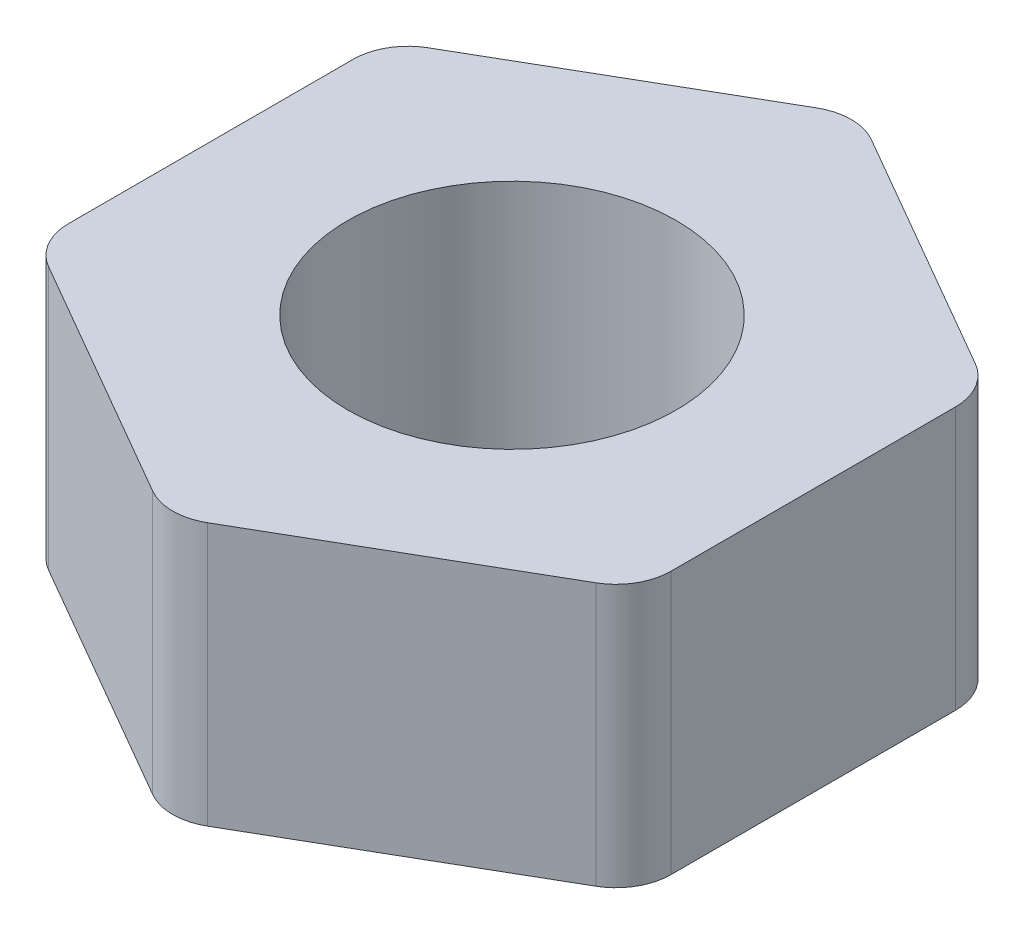
ISO-10303-21;
HEADER;
FILE_DESCRIPTION(('STEP AP214'),'2;1');
FILE_NAME('part.step','',(''),(''),'','','');
FILE_SCHEMA(('AUTOMOTIVE_DESIGN { 1 0 10303 214 1 1 1 1 }'));
ENDSEC;
DATA;
#1=APPLICATION_CONTEXT('core data for automotive mechanical design processes');
#2=APPLICATION_PROTOCOL_DEFINITION('international standard','automotive_design',2000,#1);
#3=PRODUCT_CONTEXT('',#1,'mechanical');
#4=PRODUCT('Part','Part','',(#3));
#5=PRODUCT_RELATED_PRODUCT_CATEGORY('part','',(#4));
#6=PRODUCT_DEFINITION_FORMATION('','',#4);
#7=PRODUCT_DEFINITION_CONTEXT('part definition',#1,'design');
#8=PRODUCT_DEFINITION('design','',#6,#7);
#9=PRODUCT_DEFINITION_SHAPE('','',#8);
#10=(LENGTH_UNIT() NAMED_UNIT(*) SI_UNIT(.MILLI.,.METRE.));
#11=(NAMED_UNIT(*) PLANE_ANGLE_UNIT() SI_UNIT($,.RADIAN.));
#12=(NAMED_UNIT(*) SI_UNIT($,.STERADIAN.) SOLID_ANGLE_UNIT());
#13=UNCERTAINTY_MEASURE_WITH_UNIT(LENGTH_MEASURE(1.E-05),#10,'distance_accuracy_value','');
#14=(GEOMETRIC_REPRESENTATION_CONTEXT(3) GLOBAL_UNCERTAINTY_ASSIGNED_CONTEXT((#13)) GLOBAL_UNIT_ASSIGNED_CONTEXT((#10,
#11,#12)) REPRESENTATION_CONTEXT('',''));
#15=CARTESIAN_POINT('',(0.,0.,0.));
#16=DIRECTION('',(0.,0.,1.));
#17=DIRECTION('',(1.,0.,0.));
#18=AXIS2_PLACEMENT_3D('',#15,#16,#17);
#19=CARTESIAN_POINT('',(0.,2.4,0.));
#20=DIRECTION('',(0.,1.,0.));
#21=DIRECTION('',(0.,0.,1.));
#22=AXIS2_PLACEMENT_3D('',#19,#20,#21);
#23=PLANE('',#22);
#24=DIRECTION('',(-0.866025403784439,0.,0.5));
#25=VECTOR('',#24,1.);
#26=CARTESIAN_POINT('',(0.,2.4,-3.17542648054294));
#27=LINE('',#26,#25);
#28=CARTESIAN_POINT('',(-0.249999999999999,2.4,-3.03108891324554));
#29=VERTEX_POINT('',#28);
#30=CARTESIAN_POINT('',(-2.5,2.4,-1.73205080756888));
#31=VERTEX_POINT('',#30);
#32=EDGE_CURVE('E289',#29,#31,#27,.T.);
#33=ORIENTED_EDGE('',*,*,#32,.T.);
#34=CARTESIAN_POINT('',(-2.25,2.4,-1.29903810567666));
#35=DIRECTION('',(0.,1.,0.));
#36=DIRECTION('',(0.,0.,1.));
#37=AXIS2_PLACEMENT_3D('',#34,#35,#36);
#38=CIRCLE('',#37,0.5);
#39=CARTESIAN_POINT('',(-2.75,2.4,-1.29903810567666));
#40=VERTEX_POINT('',#39);
#41=EDGE_CURVE('E220',#31,#40,#38,.T.);
#42=ORIENTED_EDGE('',*,*,#41,.T.);
#43=DIRECTION('',(0.,0.,1.));
#44=VECTOR('',#43,1.);
#45=CARTESIAN_POINT('',(-2.75,2.4,-1.58771324027147));
#46=LINE('',#45,#44);
#47=CARTESIAN_POINT('',(-2.75,2.4,1.29903810567666));
#48=VERTEX_POINT('',#47);
#49=EDGE_CURVE('E157',#40,#48,#46,.T.);
#50=ORIENTED_EDGE('',*,*,#49,.T.);
#51=CARTESIAN_POINT('',(-2.25,2.4,1.29903810567666));
#52=DIRECTION('',(0.,1.,0.));
#53=DIRECTION('',(0.,0.,1.));
#54=AXIS2_PLACEMENT_3D('',#51,#52,#53);
#55=CIRCLE('',#54,0.5);
#56=CARTESIAN_POINT('',(-2.5,2.4,1.73205080756888));
#57=VERTEX_POINT('',#56);
#58=EDGE_CURVE('E206',#48,#57,#55,.T.);
#59=ORIENTED_EDGE('',*,*,#58,.T.);
#60=DIRECTION('',(0.866025403784438,0.,0.5));
#61=VECTOR('',#60,1.);
#62=CARTESIAN_POINT('',(-2.75,2.4,1.58771324027147));
#63=LINE('',#62,#61);
#64=CARTESIAN_POINT('',(-0.250000000000001,2.4,3.03108891324554));
#65=VERTEX_POINT('',#64);
#66=EDGE_CURVE('E250',#57,#65,#63,.T.);
#67=ORIENTED_EDGE('',*,*,#66,.T.);
#68=CARTESIAN_POINT('',(0.,2.4,2.59807621135332));
#69=DIRECTION('',(0.,1.,0.));
#70=DIRECTION('',(0.,0.,1.));
#71=AXIS2_PLACEMENT_3D('',#68,#69,#70);
#72=CIRCLE('',#71,0.5);
#73=CARTESIAN_POINT('',(0.249999999999999,2.4,3.03108891324554));
#74=VERTEX_POINT('',#73);
#75=EDGE_CURVE('E209',#65,#74,#72,.T.);
#76=ORIENTED_EDGE('',*,*,#75,.T.);
#77=DIRECTION('',(0.866025403784439,0.,-0.5));
#78=VECTOR('',#77,1.);
#79=CARTESIAN_POINT('',(0.,2.4,3.17542648054294));
#80=LINE('',#79,#78);
#81=CARTESIAN_POINT('',(2.5,2.4,1.73205080756888));
#82=VERTEX_POINT('',#81);
#83=EDGE_CURVE('E262',#74,#82,#80,.T.);
#84=ORIENTED_EDGE('',*,*,#83,.T.);
#85=CARTESIAN_POINT('',(2.25,2.4,1.29903810567666));
#86=DIRECTION('',(0.,1.,0.));
#87=DIRECTION('',(0.,0.,1.));
#88=AXIS2_PLACEMENT_3D('',#85,#86,#87);
#89=CIRCLE('',#88,0.5);
#90=CARTESIAN_POINT('',(2.75,2.4,1.29903810567666));
#91=VERTEX_POINT('',#90);
#92=EDGE_CURVE('E68',#82,#91,#89,.T.);
#93=ORIENTED_EDGE('',*,*,#92,.T.);
#94=DIRECTION('',(0.,0.,-1.));
#95=VECTOR('',#94,1.);
#96=CARTESIAN_POINT('',(2.75,2.4,1.58771324027147));
#97=LINE('',#96,#95);
#98=CARTESIAN_POINT('',(2.75,2.4,-1.29903810567666));
#99=VERTEX_POINT('',#98);
#100=EDGE_CURVE('E186',#91,#99,#97,.T.);
#101=ORIENTED_EDGE('',*,*,#100,.T.);
#102=CARTESIAN_POINT('',(2.25,2.4,-1.29903810567666));
#103=DIRECTION('',(0.,1.,0.));
#104=DIRECTION('',(0.,0.,1.));
#105=AXIS2_PLACEMENT_3D('',#102,#103,#104);
#106=CIRCLE('',#105,0.5);
#107=CARTESIAN_POINT('',(2.5,2.4,-1.73205080756888));
#108=VERTEX_POINT('',#107);
#109=EDGE_CURVE('E214',#99,#108,#106,.T.);
#110=ORIENTED_EDGE('',*,*,#109,.T.);
#111=DIRECTION('',(-0.866025403784439,0.,-0.5));
#112=VECTOR('',#111,1.);
#113=CARTESIAN_POINT('',(2.75,2.4,-1.58771324027147));
#114=LINE('',#113,#112);
#115=CARTESIAN_POINT('',(0.25,2.4,-3.03108891324554));
#116=VERTEX_POINT('',#115);
#117=EDGE_CURVE('E184',#108,#116,#114,.T.);
#118=ORIENTED_EDGE('',*,*,#117,.T.);
#119=CARTESIAN_POINT('',(0.,2.4,-2.59807621135332));
#120=DIRECTION('',(0.,1.,0.));
#121=DIRECTION('',(0.,0.,1.));
#122=AXIS2_PLACEMENT_3D('',#119,#120,#121);
#123=CIRCLE('',#122,0.5);
#124=EDGE_CURVE('E217',#116,#29,#123,.T.);
#125=ORIENTED_EDGE('',*,*,#124,.T.);
#126=EDGE_LOOP('',(#33,#42,#50,#59,#67,#76,#84,#93,#101,#110,#118,#125));
#127=FACE_BOUND('',#126,.T.);
#128=CARTESIAN_POINT('',(0.,2.4,0.));
#129=DIRECTION('',(0.,1.,0.));
#130=DIRECTION('',(0.,0.,1.));
#131=AXIS2_PLACEMENT_3D('',#128,#129,#130);
#132=CIRCLE('',#131,1.5);
#133=CARTESIAN_POINT('',(0.,2.4,1.5));
#134=VERTEX_POINT('',#133);
#135=EDGE_CURVE('E272',#134,#134,#132,.T.);
#136=ORIENTED_EDGE('',*,*,#135,.F.);
#137=EDGE_LOOP('',(#136));
#138=FACE_BOUND('',#137,.T.);
#139=ADVANCED_FACE('F45',(#127,#138),#23,.T.);
#140=CARTESIAN_POINT('',(0.,0.,0.));
#141=DIRECTION('',(0.,1.,0.));
#142=DIRECTION('',(0.,0.,1.));
#143=AXIS2_PLACEMENT_3D('',#140,#141,#142);
#144=PLANE('',#143);
#145=DIRECTION('',(0.,0.,1.));
#146=VECTOR('',#145,1.);
#147=CARTESIAN_POINT('',(-2.75,0.,-1.58771324027147));
#148=LINE('',#147,#146);
#149=CARTESIAN_POINT('',(-2.75,0.,-1.29903810567666));
#150=VERTEX_POINT('',#149);
#151=CARTESIAN_POINT('',(-2.75,0.,1.29903810567666));
#152=VERTEX_POINT('',#151);
#153=EDGE_CURVE('E154',#150,#152,#148,.T.);
#154=ORIENTED_EDGE('',*,*,#153,.F.);
#155=CARTESIAN_POINT('',(-2.25,0.,-1.29903810567666));
#156=DIRECTION('',(0.,1.,0.));
#157=DIRECTION('',(0.,0.,1.));
#158=AXIS2_PLACEMENT_3D('',#155,#156,#157);
#159=CIRCLE('',#158,0.5);
#160=CARTESIAN_POINT('',(-2.5,0.,-1.73205080756888));
#161=VERTEX_POINT('',#160);
#162=EDGE_CURVE('E136',#150,#161,#159,.F.);
#163=ORIENTED_EDGE('',*,*,#162,.T.);
#164=DIRECTION('',(-0.866025403784439,0.,0.5));
#165=VECTOR('',#164,1.);
#166=CARTESIAN_POINT('',(0.,0.,-3.17542648054294));
#167=LINE('',#166,#165);
#168=CARTESIAN_POINT('',(-0.249999999999999,0.,-3.03108891324554));
#169=VERTEX_POINT('',#168);
#170=EDGE_CURVE('E167',#169,#161,#167,.T.);
#171=ORIENTED_EDGE('',*,*,#170,.F.);
#172=CARTESIAN_POINT('',(0.,0.,-2.59807621135332));
#173=DIRECTION('',(0.,1.,0.));
#174=DIRECTION('',(0.,0.,1.));
#175=AXIS2_PLACEMENT_3D('',#172,#173,#174);
#176=CIRCLE('',#175,0.5);
#177=CARTESIAN_POINT('',(0.25,0.,-3.03108891324554));
#178=VERTEX_POINT('',#177);
#179=EDGE_CURVE('E148',#169,#178,#176,.F.);
#180=ORIENTED_EDGE('',*,*,#179,.T.);
#181=DIRECTION('',(-0.866025403784439,0.,-0.5));
#182=VECTOR('',#181,1.);
#183=CARTESIAN_POINT('',(2.75,0.,-1.58771324027147));
#184=LINE('',#183,#182);
#185=CARTESIAN_POINT('',(2.5,0.,-1.73205080756888));
#186=VERTEX_POINT('',#185);
#187=EDGE_CURVE('E174',#186,#178,#184,.T.);
#188=ORIENTED_EDGE('',*,*,#187,.F.);
#189=CARTESIAN_POINT('',(2.25,0.,-1.29903810567666));
#190=DIRECTION('',(0.,1.,0.));
#191=DIRECTION('',(0.,0.,1.));
#192=AXIS2_PLACEMENT_3D('',#189,#190,#191);
#193=CIRCLE('',#192,0.5);
#194=CARTESIAN_POINT('',(2.75,0.,-1.29903810567666));
#195=VERTEX_POINT('',#194);
#196=EDGE_CURVE('E196',#186,#195,#193,.F.);
#197=ORIENTED_EDGE('',*,*,#196,.T.);
#198=DIRECTION('',(0.,0.,-1.));
#199=VECTOR('',#198,1.);
#200=CARTESIAN_POINT('',(2.75,0.,1.58771324027147));
#201=LINE('',#200,#199);
#202=CARTESIAN_POINT('',(2.75,0.,1.29903810567666));
#203=VERTEX_POINT('',#202);
#204=EDGE_CURVE('E181',#203,#195,#201,.T.);
#205=ORIENTED_EDGE('',*,*,#204,.F.);
#206=CARTESIAN_POINT('',(2.25,0.,1.29903810567666));
#207=DIRECTION('',(0.,1.,0.));
#208=DIRECTION('',(0.,0.,1.));
#209=AXIS2_PLACEMENT_3D('',#206,#207,#208);
#210=CIRCLE('',#209,0.5);
#211=CARTESIAN_POINT('',(2.5,0.,1.73205080756888));
#212=VERTEX_POINT('',#211);
#213=EDGE_CURVE('E193',#203,#212,#210,.F.);
#214=ORIENTED_EDGE('',*,*,#213,.T.);
#215=DIRECTION('',(0.866025403784439,0.,-0.5));
#216=VECTOR('',#215,1.);
#217=CARTESIAN_POINT('',(0.,0.,3.17542648054294));
#218=LINE('',#217,#216);
#219=CARTESIAN_POINT('',(0.249999999999999,0.,3.03108891324554));
#220=VERTEX_POINT('',#219);
#221=EDGE_CURVE('E172',#220,#212,#218,.T.);
#222=ORIENTED_EDGE('',*,*,#221,.F.);
#223=CARTESIAN_POINT('',(0.,0.,2.59807621135332));
#224=DIRECTION('',(0.,1.,0.));
#225=DIRECTION('',(0.,0.,1.));
#226=AXIS2_PLACEMENT_3D('',#223,#224,#225);
#227=CIRCLE('',#226,0.5);
#228=CARTESIAN_POINT('',(-0.250000000000001,0.,3.03108891324554));
#229=VERTEX_POINT('',#228);
#230=EDGE_CURVE('E190',#220,#229,#227,.F.);
#231=ORIENTED_EDGE('',*,*,#230,.T.);
#232=DIRECTION('',(0.866025403784438,0.,0.5));
#233=VECTOR('',#232,1.);
#234=CARTESIAN_POINT('',(-2.75,0.,1.58771324027147));
#235=LINE('',#234,#233);
#236=CARTESIAN_POINT('',(-2.5,0.,1.73205080756888));
#237=VERTEX_POINT('',#236);
#238=EDGE_CURVE('E166',#237,#229,#235,.T.);
#239=ORIENTED_EDGE('',*,*,#238,.F.);
#240=CARTESIAN_POINT('',(-2.25,0.,1.29903810567666));
#241=DIRECTION('',(0.,1.,0.));
#242=DIRECTION('',(0.,0.,1.));
#243=AXIS2_PLACEMENT_3D('',#240,#241,#242);
#244=CIRCLE('',#243,0.5);
#245=EDGE_CURVE('E159',#237,#152,#244,.F.);
#246=ORIENTED_EDGE('',*,*,#245,.T.);
#247=EDGE_LOOP('',(#154,#163,#171,#180,#188,#197,#205,#214,#222,#231,#239,#246));
#248=FACE_BOUND('',#247,.T.);
#249=CARTESIAN_POINT('',(0.,0.,0.));
#250=DIRECTION('',(0.,1.,0.));
#251=DIRECTION('',(0.,0.,1.));
#252=AXIS2_PLACEMENT_3D('',#249,#250,#251);
#253=CIRCLE('',#252,1.5);
#254=CARTESIAN_POINT('',(0.,0.,1.5));
#255=VERTEX_POINT('',#254);
#256=EDGE_CURVE('E278',#255,#255,#253,.T.);
#257=ORIENTED_EDGE('',*,*,#256,.T.);
#258=EDGE_LOOP('',(#257));
#259=FACE_BOUND('',#258,.T.);
#260=ADVANCED_FACE('F162',(#248,#259),#144,.F.);
#261=CARTESIAN_POINT('',(2.75,2.4,-1.58771324027147));
#262=DIRECTION('',(-0.5,0.,0.866025403784439));
#263=DIRECTION('',(0.866025403784439,0.,0.5));
#264=AXIS2_PLACEMENT_3D('',#261,#262,#263);
#265=PLANE('',#264);
#266=ORIENTED_EDGE('',*,*,#187,.T.);
#267=DIRECTION('',(0.,-1.,0.));
#268=VECTOR('',#267,1.);
#269=CARTESIAN_POINT('',(0.25,2.4,-3.03108891324554));
#270=LINE('',#269,#268);
#271=EDGE_CURVE('E227',#178,#116,#270,.F.);
#272=ORIENTED_EDGE('',*,*,#271,.T.);
#273=ORIENTED_EDGE('',*,*,#117,.F.);
#274=DIRECTION('',(0.,-1.,0.));
#275=VECTOR('',#274,1.);
#276=CARTESIAN_POINT('',(2.5,2.4,-1.73205080756888));
#277=LINE('',#276,#275);
#278=EDGE_CURVE('E223',#108,#186,#277,.T.);
#279=ORIENTED_EDGE('',*,*,#278,.T.);
#280=EDGE_LOOP('',(#266,#272,#273,#279));
#281=FACE_BOUND('',#280,.T.);
#282=ADVANCED_FACE('F305',(#281),#265,.F.);
#283=CARTESIAN_POINT('',(0.,2.4,-3.17542648054294));
#284=DIRECTION('',(0.5,0.,0.866025403784439));
#285=DIRECTION('',(0.866025403784439,0.,-0.5));
#286=AXIS2_PLACEMENT_3D('',#283,#284,#285);
#287=PLANE('',#286);
#288=ORIENTED_EDGE('',*,*,#170,.T.);
#289=DIRECTION('',(0.,-1.,0.));
#290=VECTOR('',#289,1.);
#291=CARTESIAN_POINT('',(-2.5,2.4,-1.73205080756888));
#292=LINE('',#291,#290);
#293=EDGE_CURVE('E141',#161,#31,#292,.F.);
#294=ORIENTED_EDGE('',*,*,#293,.T.);
#295=ORIENTED_EDGE('',*,*,#32,.F.);
#296=DIRECTION('',(0.,-1.,0.));
#297=VECTOR('',#296,1.);
#298=CARTESIAN_POINT('',(-0.249999999999999,2.4,-3.03108891324554));
#299=LINE('',#298,#297);
#300=EDGE_CURVE('E147',#29,#169,#299,.T.);
#301=ORIENTED_EDGE('',*,*,#300,.T.);
#302=EDGE_LOOP('',(#288,#294,#295,#301));
#303=FACE_BOUND('',#302,.T.);
#304=ADVANCED_FACE('F319',(#303),#287,.F.);
#305=CARTESIAN_POINT('',(-2.75,2.4,-1.58771324027147));
#306=DIRECTION('',(1.,0.,0.));
#307=DIRECTION('',(0.,0.,-1.));
#308=AXIS2_PLACEMENT_3D('',#305,#306,#307);
#309=PLANE('',#308);
#310=ORIENTED_EDGE('',*,*,#49,.F.);
#311=DIRECTION('',(0.,-1.,0.));
#312=VECTOR('',#311,1.);
#313=CARTESIAN_POINT('',(-2.75,2.4,-1.29903810567666));
#314=LINE('',#313,#312);
#315=EDGE_CURVE('E140',#40,#150,#314,.T.);
#316=ORIENTED_EDGE('',*,*,#315,.T.);
#317=ORIENTED_EDGE('',*,*,#153,.T.);
#318=DIRECTION('',(0.,-1.,0.));
#319=VECTOR('',#318,1.);
#320=CARTESIAN_POINT('',(-2.75,2.4,1.29903810567666));
#321=LINE('',#320,#319);
#322=EDGE_CURVE('E160',#152,#48,#321,.F.);
#323=ORIENTED_EDGE('',*,*,#322,.T.);
#324=EDGE_LOOP('',(#310,#316,#317,#323));
#325=FACE_BOUND('',#324,.T.);
#326=ADVANCED_FACE('F153',(#325),#309,.F.);
#327=CARTESIAN_POINT('',(-2.75,2.4,1.58771324027147));
#328=DIRECTION('',(0.5,0.,-0.866025403784439));
#329=DIRECTION('',(-0.866025403784439,0.,-0.5));
#330=AXIS2_PLACEMENT_3D('',#327,#328,#329);
#331=PLANE('',#330);
#332=ORIENTED_EDGE('',*,*,#238,.T.);
#333=DIRECTION('',(0.,-1.,0.));
#334=VECTOR('',#333,1.);
#335=CARTESIAN_POINT('',(-0.250000000000001,2.4,3.03108891324554));
#336=LINE('',#335,#334);
#337=EDGE_CURVE('E11',#229,#65,#336,.F.);
#338=ORIENTED_EDGE('',*,*,#337,.T.);
#339=ORIENTED_EDGE('',*,*,#66,.F.);
#340=DIRECTION('',(0.,-1.,0.));
#341=VECTOR('',#340,1.);
#342=CARTESIAN_POINT('',(-2.5,2.4,1.73205080756888));
#343=LINE('',#342,#341);
#344=EDGE_CURVE('E54',#57,#237,#343,.T.);
#345=ORIENTED_EDGE('',*,*,#344,.T.);
#346=EDGE_LOOP('',(#332,#338,#339,#345));
#347=FACE_BOUND('',#346,.T.);
#348=ADVANCED_FACE('F247',(#347),#331,.F.);
#349=CARTESIAN_POINT('',(0.,2.4,3.17542648054294));
#350=DIRECTION('',(-0.5,0.,-0.866025403784439));
#351=DIRECTION('',(-0.866025403784439,0.,0.5));
#352=AXIS2_PLACEMENT_3D('',#349,#350,#351);
#353=PLANE('',#352);
#354=ORIENTED_EDGE('',*,*,#221,.T.);
#355=DIRECTION('',(0.,-1.,0.));
#356=VECTOR('',#355,1.);
#357=CARTESIAN_POINT('',(2.5,2.4,1.73205080756888));
#358=LINE('',#357,#356);
#359=EDGE_CURVE('E240',#212,#82,#358,.F.);
#360=ORIENTED_EDGE('',*,*,#359,.T.);
#361=ORIENTED_EDGE('',*,*,#83,.F.);
#362=DIRECTION('',(0.,-1.,0.));
#363=VECTOR('',#362,1.);
#364=CARTESIAN_POINT('',(0.249999999999999,2.4,3.03108891324554));
#365=LINE('',#364,#363);
#366=EDGE_CURVE('E236',#74,#220,#365,.T.);
#367=ORIENTED_EDGE('',*,*,#366,.T.);
#368=EDGE_LOOP('',(#354,#360,#361,#367));
#369=FACE_BOUND('',#368,.T.);
#370=ADVANCED_FACE('F260',(#369),#353,.F.);
#371=CARTESIAN_POINT('',(2.75,2.4,1.58771324027147));
#372=DIRECTION('',(-1.,0.,0.));
#373=DIRECTION('',(0.,0.,1.));
#374=AXIS2_PLACEMENT_3D('',#371,#372,#373);
#375=PLANE('',#374);
#376=ORIENTED_EDGE('',*,*,#204,.T.);
#377=DIRECTION('',(0.,-1.,0.));
#378=VECTOR('',#377,1.);
#379=CARTESIAN_POINT('',(2.75,2.4,-1.29903810567666));
#380=LINE('',#379,#378);
#381=EDGE_CURVE('E61',#195,#99,#380,.F.);
#382=ORIENTED_EDGE('',*,*,#381,.T.);
#383=ORIENTED_EDGE('',*,*,#100,.F.);
#384=DIRECTION('',(0.,-1.,0.));
#385=VECTOR('',#384,1.);
#386=CARTESIAN_POINT('',(2.75,2.4,1.29903810567666));
#387=LINE('',#386,#385);
#388=EDGE_CURVE('E230',#91,#203,#387,.T.);
#389=ORIENTED_EDGE('',*,*,#388,.T.);
#390=EDGE_LOOP('',(#376,#382,#383,#389));
#391=FACE_BOUND('',#390,.T.);
#392=ADVANCED_FACE('F310',(#391),#375,.F.);
#393=CARTESIAN_POINT('',(0.,2.4,0.));
#394=DIRECTION('',(0.,-1.,0.));
#395=DIRECTION('',(0.,0.,-1.));
#396=AXIS2_PLACEMENT_3D('',#393,#394,#395);
#397=CYLINDRICAL_SURFACE('',#396,1.5);
#398=ORIENTED_EDGE('',*,*,#135,.T.);
#399=EDGE_LOOP('',(#398));
#400=FACE_BOUND('',#399,.T.);
#401=ORIENTED_EDGE('',*,*,#256,.F.);
#402=EDGE_LOOP('',(#401));
#403=FACE_BOUND('',#402,.T.);
#404=ADVANCED_FACE('F308',(#400,#403),#397,.F.);
#405=CARTESIAN_POINT('',(-2.25,2.4,-1.29903810567666));
#406=DIRECTION('',(0.,-1.,0.));
#407=DIRECTION('',(0.,0.,-1.));
#408=AXIS2_PLACEMENT_3D('',#405,#406,#407);
#409=CYLINDRICAL_SURFACE('',#408,0.5);
#410=ORIENTED_EDGE('',*,*,#41,.F.);
#411=ORIENTED_EDGE('',*,*,#293,.F.);
#412=ORIENTED_EDGE('',*,*,#162,.F.);
#413=ORIENTED_EDGE('',*,*,#315,.F.);
#414=EDGE_LOOP('',(#410,#411,#412,#413));
#415=FACE_BOUND('',#414,.T.);
#416=ADVANCED_FACE('F139',(#415),#409,.T.);
#417=CARTESIAN_POINT('',(0.,2.4,-2.59807621135332));
#418=DIRECTION('',(0.,-1.,0.));
#419=DIRECTION('',(0.,0.,-1.));
#420=AXIS2_PLACEMENT_3D('',#417,#418,#419);
#421=CYLINDRICAL_SURFACE('',#420,0.5);
#422=ORIENTED_EDGE('',*,*,#124,.F.);
#423=ORIENTED_EDGE('',*,*,#271,.F.);
#424=ORIENTED_EDGE('',*,*,#179,.F.);
#425=ORIENTED_EDGE('',*,*,#300,.F.);
#426=EDGE_LOOP('',(#422,#423,#424,#425));
#427=FACE_BOUND('',#426,.T.);
#428=ADVANCED_FACE('F327',(#427),#421,.T.);
#429=CARTESIAN_POINT('',(2.25,2.4,-1.29903810567666));
#430=DIRECTION('',(0.,-1.,0.));
#431=DIRECTION('',(0.,0.,-1.));
#432=AXIS2_PLACEMENT_3D('',#429,#430,#431);
#433=CYLINDRICAL_SURFACE('',#432,0.5);
#434=ORIENTED_EDGE('',*,*,#109,.F.);
#435=ORIENTED_EDGE('',*,*,#381,.F.);
#436=ORIENTED_EDGE('',*,*,#196,.F.);
#437=ORIENTED_EDGE('',*,*,#278,.F.);
#438=EDGE_LOOP('',(#434,#435,#436,#437));
#439=FACE_BOUND('',#438,.T.);
#440=ADVANCED_FACE('F330',(#439),#433,.T.);
#441=CARTESIAN_POINT('',(2.25,2.4,1.29903810567666));
#442=DIRECTION('',(0.,-1.,0.));
#443=DIRECTION('',(0.,0.,-1.));
#444=AXIS2_PLACEMENT_3D('',#441,#442,#443);
#445=CYLINDRICAL_SURFACE('',#444,0.5);
#446=ORIENTED_EDGE('',*,*,#92,.F.);
#447=ORIENTED_EDGE('',*,*,#359,.F.);
#448=ORIENTED_EDGE('',*,*,#213,.F.);
#449=ORIENTED_EDGE('',*,*,#388,.F.);
#450=EDGE_LOOP('',(#446,#447,#448,#449));
#451=FACE_BOUND('',#450,.T.);
#452=ADVANCED_FACE('F298',(#451),#445,.T.);
#453=CARTESIAN_POINT('',(0.,2.4,2.59807621135332));
#454=DIRECTION('',(0.,-1.,0.));
#455=DIRECTION('',(0.,0.,-1.));
#456=AXIS2_PLACEMENT_3D('',#453,#454,#455);
#457=CYLINDRICAL_SURFACE('',#456,0.5);
#458=ORIENTED_EDGE('',*,*,#75,.F.);
#459=ORIENTED_EDGE('',*,*,#337,.F.);
#460=ORIENTED_EDGE('',*,*,#230,.F.);
#461=ORIENTED_EDGE('',*,*,#366,.F.);
#462=EDGE_LOOP('',(#458,#459,#460,#461));
#463=FACE_BOUND('',#462,.T.);
#464=ADVANCED_FACE('F257',(#463),#457,.T.);
#465=CARTESIAN_POINT('',(-2.25,2.4,1.29903810567666));
#466=DIRECTION('',(0.,-1.,0.));
#467=DIRECTION('',(0.,0.,-1.));
#468=AXIS2_PLACEMENT_3D('',#465,#466,#467);
#469=CYLINDRICAL_SURFACE('',#468,0.5);
#470=ORIENTED_EDGE('',*,*,#58,.F.);
#471=ORIENTED_EDGE('',*,*,#322,.F.);
#472=ORIENTED_EDGE('',*,*,#245,.F.);
#473=ORIENTED_EDGE('',*,*,#344,.F.);
#474=EDGE_LOOP('',(#470,#471,#472,#473));
#475=FACE_BOUND('',#474,.T.);
#476=ADVANCED_FACE('F47',(#475),#469,.T.);
#477=CLOSED_SHELL('',(#139,#260,#282,#304,#326,#348,#370,#392,#404,#416,#428,#440,#452,#464,#476));
#478=MANIFOLD_SOLID_BREP('B2',#477);
#479=ADVANCED_BREP_SHAPE_REPRESENTATION('',(#18,#478),#14);
#480=SHAPE_DEFINITION_REPRESENTATION(#9,#479);
ENDSEC;
END-ISO-10303-21;
